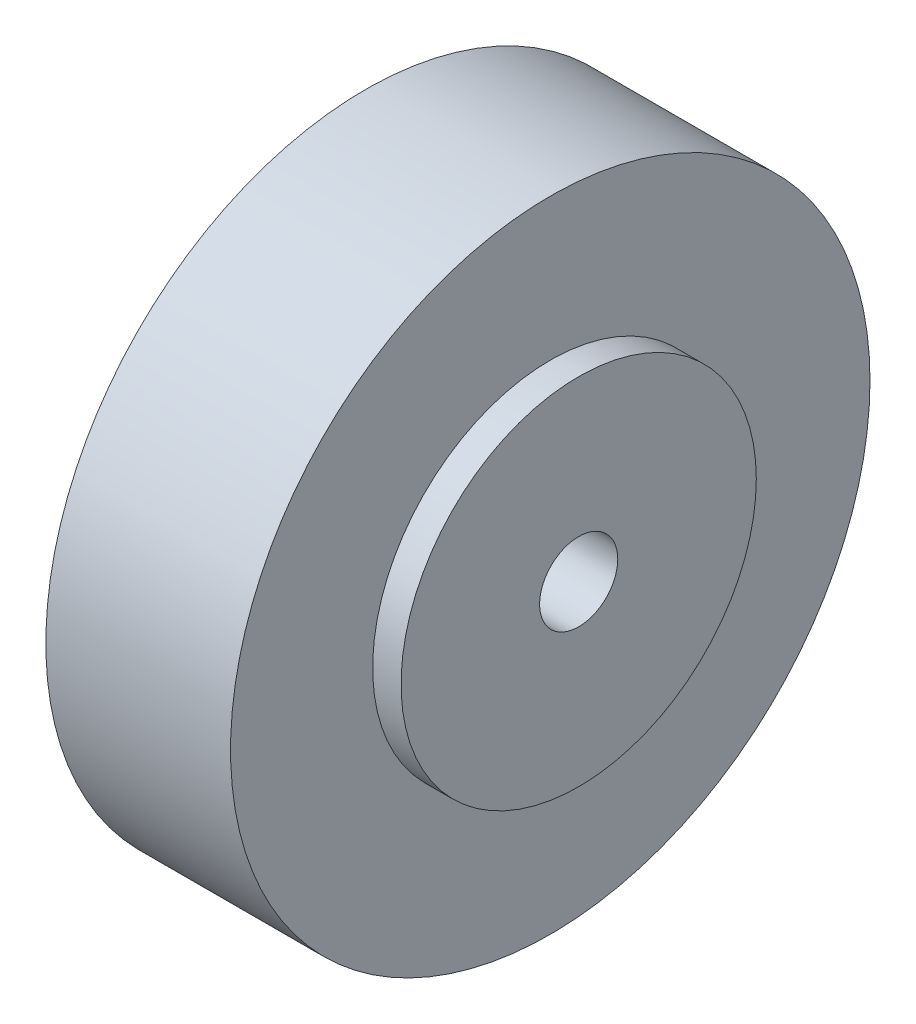
ISO-10303-21;
HEADER;
FILE_DESCRIPTION(('STEP AP214'),'2;1');
FILE_NAME('part.step','',(''),(''),'','','');
FILE_SCHEMA(('AUTOMOTIVE_DESIGN { 1 0 10303 214 1 1 1 1 }'));
ENDSEC;
DATA;
#1=APPLICATION_CONTEXT('core data for automotive mechanical design processes');
#2=APPLICATION_PROTOCOL_DEFINITION('international standard','automotive_design',2000,#1);
#3=PRODUCT_CONTEXT('',#1,'mechanical');
#4=PRODUCT('Part','Part','',(#3));
#5=PRODUCT_RELATED_PRODUCT_CATEGORY('part','',(#4));
#6=PRODUCT_DEFINITION_FORMATION('','',#4);
#7=PRODUCT_DEFINITION_CONTEXT('part definition',#1,'design');
#8=PRODUCT_DEFINITION('design','',#6,#7);
#9=PRODUCT_DEFINITION_SHAPE('','',#8);
#10=(LENGTH_UNIT() NAMED_UNIT(*) SI_UNIT(.MILLI.,.METRE.));
#11=(NAMED_UNIT(*) PLANE_ANGLE_UNIT() SI_UNIT($,.RADIAN.));
#12=(NAMED_UNIT(*) SI_UNIT($,.STERADIAN.) SOLID_ANGLE_UNIT());
#13=UNCERTAINTY_MEASURE_WITH_UNIT(LENGTH_MEASURE(1.E-05),#10,'distance_accuracy_value','');
#14=(GEOMETRIC_REPRESENTATION_CONTEXT(3) GLOBAL_UNCERTAINTY_ASSIGNED_CONTEXT((#13)) GLOBAL_UNIT_ASSIGNED_CONTEXT((#10,
#11,#12)) REPRESENTATION_CONTEXT('',''));
#15=CARTESIAN_POINT('',(0.,0.,0.));
#16=DIRECTION('',(0.,0.,1.));
#17=DIRECTION('',(1.,0.,0.));
#18=AXIS2_PLACEMENT_3D('',#15,#16,#17);
#19=CARTESIAN_POINT('',(-15.,0.,0.));
#20=DIRECTION('',(1.,0.,0.));
#21=DIRECTION('',(0.,0.,-1.));
#22=AXIS2_PLACEMENT_3D('',#19,#20,#21);
#23=CYLINDRICAL_SURFACE('',#22,22.5);
#24=CARTESIAN_POINT('',(-15.,0.,0.));
#25=DIRECTION('',(1.,0.,0.));
#26=DIRECTION('',(0.,0.,-1.));
#27=AXIS2_PLACEMENT_3D('',#24,#25,#26);
#28=CIRCLE('',#27,22.5);
#29=CARTESIAN_POINT('',(-15.,0.,-22.5));
#30=VERTEX_POINT('',#29);
#31=EDGE_CURVE('E11',#30,#30,#28,.T.);
#32=ORIENTED_EDGE('',*,*,#31,.T.);
#33=EDGE_LOOP('',(#32));
#34=FACE_BOUND('',#33,.T.);
#35=CARTESIAN_POINT('',(-2.,0.,0.));
#36=DIRECTION('',(1.,0.,0.));
#37=DIRECTION('',(0.,0.,-1.));
#38=AXIS2_PLACEMENT_3D('',#35,#36,#37);
#39=CIRCLE('',#38,22.5);
#40=CARTESIAN_POINT('',(-2.,0.,-22.5));
#41=VERTEX_POINT('',#40);
#42=EDGE_CURVE('E63',#41,#41,#39,.T.);
#43=ORIENTED_EDGE('',*,*,#42,.F.);
#44=EDGE_LOOP('',(#43));
#45=FACE_BOUND('',#44,.T.);
#46=ADVANCED_FACE('F43',(#34,#45),#23,.T.);
#47=CARTESIAN_POINT('',(0.,0.,0.));
#48=DIRECTION('',(1.,0.,0.));
#49=DIRECTION('',(0.,0.,-1.));
#50=AXIS2_PLACEMENT_3D('',#47,#48,#49);
#51=PLANE('',#50);
#52=CARTESIAN_POINT('',(0.,0.,0.));
#53=DIRECTION('',(1.,0.,0.));
#54=DIRECTION('',(0.,0.,-1.));
#55=AXIS2_PLACEMENT_3D('',#52,#53,#54);
#56=CIRCLE('',#55,2.75);
#57=CARTESIAN_POINT('',(0.,0.,-2.75));
#58=VERTEX_POINT('',#57);
#59=EDGE_CURVE('E51',#58,#58,#56,.T.);
#60=ORIENTED_EDGE('',*,*,#59,.F.);
#61=EDGE_LOOP('',(#60));
#62=FACE_BOUND('',#61,.T.);
#63=CARTESIAN_POINT('',(0.,0.,0.));
#64=DIRECTION('',(1.,0.,0.));
#65=DIRECTION('',(0.,0.,-1.));
#66=AXIS2_PLACEMENT_3D('',#63,#64,#65);
#67=CIRCLE('',#66,12.5);
#68=CARTESIAN_POINT('',(0.,0.,-12.5));
#69=VERTEX_POINT('',#68);
#70=EDGE_CURVE('E71',#69,#69,#67,.T.);
#71=ORIENTED_EDGE('',*,*,#70,.T.);
#72=EDGE_LOOP('',(#71));
#73=FACE_BOUND('',#72,.T.);
#74=ADVANCED_FACE('F90',(#62,#73),#51,.T.);
#75=CARTESIAN_POINT('',(-15.,0.,0.));
#76=DIRECTION('',(1.,0.,0.));
#77=DIRECTION('',(0.,0.,-1.));
#78=AXIS2_PLACEMENT_3D('',#75,#76,#77);
#79=CYLINDRICAL_SURFACE('',#78,2.75);
#80=ORIENTED_EDGE('',*,*,#59,.T.);
#81=EDGE_LOOP('',(#80));
#82=FACE_BOUND('',#81,.T.);
#83=CARTESIAN_POINT('',(-9.5,0.,0.));
#84=DIRECTION('',(-1.,0.,0.));
#85=DIRECTION('',(0.,0.,1.));
#86=AXIS2_PLACEMENT_3D('',#83,#84,#85);
#87=CIRCLE('',#86,2.75);
#88=CARTESIAN_POINT('',(-9.5,0.,2.75));
#89=VERTEX_POINT('',#88);
#90=EDGE_CURVE('E46',#89,#89,#87,.F.);
#91=ORIENTED_EDGE('',*,*,#90,.F.);
#92=EDGE_LOOP('',(#91));
#93=FACE_BOUND('',#92,.T.);
#94=ADVANCED_FACE('F94',(#82,#93),#79,.F.);
#95=CARTESIAN_POINT('',(-15.,0.,0.));
#96=DIRECTION('',(1.,0.,0.));
#97=DIRECTION('',(0.,0.,-1.));
#98=AXIS2_PLACEMENT_3D('',#95,#96,#97);
#99=PLANE('',#98);
#100=CARTESIAN_POINT('',(-15.,0.,0.));
#101=DIRECTION('',(-1.,0.,0.));
#102=DIRECTION('',(0.,0.,1.));
#103=AXIS2_PLACEMENT_3D('',#100,#101,#102);
#104=CIRCLE('',#103,8.1);
#105=CARTESIAN_POINT('',(-15.,0.,8.1));
#106=VERTEX_POINT('',#105);
#107=EDGE_CURVE('E58',#106,#106,#104,.T.);
#108=ORIENTED_EDGE('',*,*,#107,.F.);
#109=EDGE_LOOP('',(#108));
#110=FACE_BOUND('',#109,.T.);
#111=ORIENTED_EDGE('',*,*,#31,.F.);
#112=EDGE_LOOP('',(#111));
#113=FACE_BOUND('',#112,.T.);
#114=ADVANCED_FACE('F99',(#110,#113),#99,.F.);
#115=CARTESIAN_POINT('',(-9.5,0.,0.));
#116=DIRECTION('',(-1.,0.,0.));
#117=DIRECTION('',(0.,0.,1.));
#118=AXIS2_PLACEMENT_3D('',#115,#116,#117);
#119=PLANE('',#118);
#120=CARTESIAN_POINT('',(-9.5,0.,0.));
#121=DIRECTION('',(-1.,0.,0.));
#122=DIRECTION('',(0.,0.,1.));
#123=AXIS2_PLACEMENT_3D('',#120,#121,#122);
#124=CIRCLE('',#123,8.1);
#125=CARTESIAN_POINT('',(-9.5,0.,8.1));
#126=VERTEX_POINT('',#125);
#127=EDGE_CURVE('E62',#126,#126,#124,.T.);
#128=ORIENTED_EDGE('',*,*,#127,.T.);
#129=EDGE_LOOP('',(#128));
#130=FACE_BOUND('',#129,.T.);
#131=ORIENTED_EDGE('',*,*,#90,.T.);
#132=EDGE_LOOP('',(#131));
#133=FACE_BOUND('',#132,.T.);
#134=ADVANCED_FACE('F106',(#130,#133),#119,.T.);
#135=CARTESIAN_POINT('',(-9.5,0.,0.));
#136=DIRECTION('',(-1.,0.,0.));
#137=DIRECTION('',(0.,0.,1.));
#138=AXIS2_PLACEMENT_3D('',#135,#136,#137);
#139=CYLINDRICAL_SURFACE('',#138,8.1);
#140=ORIENTED_EDGE('',*,*,#127,.F.);
#141=EDGE_LOOP('',(#140));
#142=FACE_BOUND('',#141,.T.);
#143=ORIENTED_EDGE('',*,*,#107,.T.);
#144=EDGE_LOOP('',(#143));
#145=FACE_BOUND('',#144,.T.);
#146=ADVANCED_FACE('F85',(#142,#145),#139,.F.);
#147=CARTESIAN_POINT('',(-2.,0.,0.));
#148=DIRECTION('',(1.,0.,0.));
#149=DIRECTION('',(0.,0.,-1.));
#150=AXIS2_PLACEMENT_3D('',#147,#148,#149);
#151=PLANE('',#150);
#152=CARTESIAN_POINT('',(-2.,0.,0.));
#153=DIRECTION('',(1.,0.,0.));
#154=DIRECTION('',(0.,0.,-1.));
#155=AXIS2_PLACEMENT_3D('',#152,#153,#154);
#156=CIRCLE('',#155,12.5);
#157=CARTESIAN_POINT('',(-2.,0.,-12.5));
#158=VERTEX_POINT('',#157);
#159=EDGE_CURVE('E70',#158,#158,#156,.T.);
#160=ORIENTED_EDGE('',*,*,#159,.F.);
#161=EDGE_LOOP('',(#160));
#162=FACE_BOUND('',#161,.T.);
#163=ORIENTED_EDGE('',*,*,#42,.T.);
#164=EDGE_LOOP('',(#163));
#165=FACE_BOUND('',#164,.T.);
#166=ADVANCED_FACE('F82',(#162,#165),#151,.T.);
#167=CARTESIAN_POINT('',(-2.,0.,0.));
#168=DIRECTION('',(1.,0.,0.));
#169=DIRECTION('',(0.,0.,-1.));
#170=AXIS2_PLACEMENT_3D('',#167,#168,#169);
#171=CYLINDRICAL_SURFACE('',#170,12.5);
#172=ORIENTED_EDGE('',*,*,#159,.T.);
#173=EDGE_LOOP('',(#172));
#174=FACE_BOUND('',#173,.T.);
#175=ORIENTED_EDGE('',*,*,#70,.F.);
#176=EDGE_LOOP('',(#175));
#177=FACE_BOUND('',#176,.T.);
#178=ADVANCED_FACE('F79',(#174,#177),#171,.T.);
#179=CLOSED_SHELL('',(#46,#74,#94,#114,#134,#146,#166,#178));
#180=MANIFOLD_SOLID_BREP('B2',#179);
#181=ADVANCED_BREP_SHAPE_REPRESENTATION('',(#18,#180),#14);
#182=SHAPE_DEFINITION_REPRESENTATION(#9,#181);
ENDSEC;
END-ISO-10303-21;
